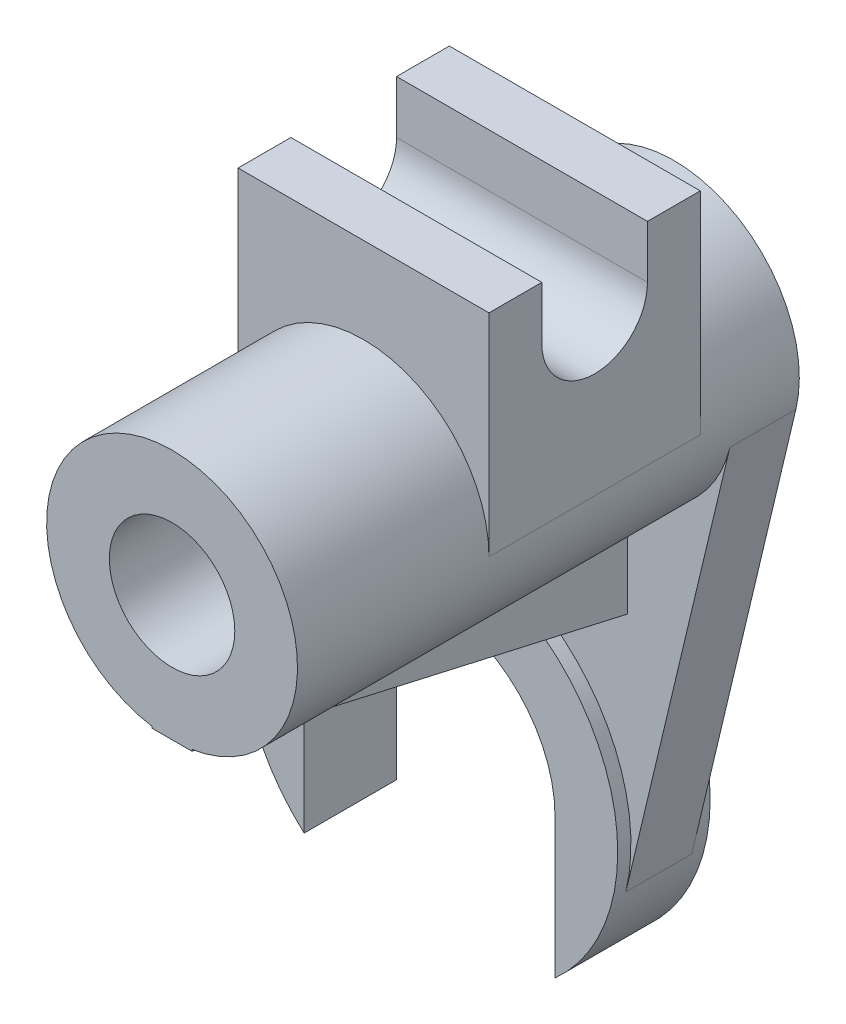
ISO-10303-21;
HEADER;
FILE_DESCRIPTION(('STEP AP214'),'2;1');
FILE_NAME('part.step','',(''),(''),'','','');
FILE_SCHEMA(('AUTOMOTIVE_DESIGN { 1 0 10303 214 1 1 1 1 }'));
ENDSEC;
DATA;
#1=APPLICATION_CONTEXT('core data for automotive mechanical design processes');
#2=APPLICATION_PROTOCOL_DEFINITION('international standard','automotive_design',2000,#1);
#3=PRODUCT_CONTEXT('',#1,'mechanical');
#4=PRODUCT('Part','Part','',(#3));
#5=PRODUCT_RELATED_PRODUCT_CATEGORY('part','',(#4));
#6=PRODUCT_DEFINITION_FORMATION('','',#4);
#7=PRODUCT_DEFINITION_CONTEXT('part definition',#1,'design');
#8=PRODUCT_DEFINITION('design','',#6,#7);
#9=PRODUCT_DEFINITION_SHAPE('','',#8);
#10=(LENGTH_UNIT() NAMED_UNIT(*) SI_UNIT(.MILLI.,.METRE.));
#11=(NAMED_UNIT(*) PLANE_ANGLE_UNIT() SI_UNIT($,.RADIAN.));
#12=(NAMED_UNIT(*) SI_UNIT($,.STERADIAN.) SOLID_ANGLE_UNIT());
#13=UNCERTAINTY_MEASURE_WITH_UNIT(LENGTH_MEASURE(1.E-05),#10,'distance_accuracy_value','');
#14=(GEOMETRIC_REPRESENTATION_CONTEXT(3) GLOBAL_UNCERTAINTY_ASSIGNED_CONTEXT((#13)) GLOBAL_UNIT_ASSIGNED_CONTEXT((#10,
#11,#12)) REPRESENTATION_CONTEXT('',''));
#15=CARTESIAN_POINT('',(0.,0.,0.));
#16=DIRECTION('',(0.,0.,1.));
#17=DIRECTION('',(1.,0.,0.));
#18=AXIS2_PLACEMENT_3D('',#15,#16,#17);
#19=CARTESIAN_POINT('',(0.,0.,38.));
#20=DIRECTION('',(0.,0.,-1.));
#21=DIRECTION('',(-1.,0.,0.));
#22=AXIS2_PLACEMENT_3D('',#19,#20,#21);
#23=CYLINDRICAL_SURFACE('',#22,19.);
#24=DIRECTION('',(0.,0.,-1.));
#25=VECTOR('',#24,1.);
#26=CARTESIAN_POINT('',(19.,0.,9.));
#27=LINE('',#26,#25);
#28=CARTESIAN_POINT('',(19.,0.,9.));
#29=VERTEX_POINT('',#28);
#30=CARTESIAN_POINT('',(19.,0.,-23.));
#31=VERTEX_POINT('',#30);
#32=EDGE_CURVE('E224',#29,#31,#27,.T.);
#33=ORIENTED_EDGE('',*,*,#32,.F.);
#34=CARTESIAN_POINT('',(0.,0.,9.));
#35=DIRECTION('',(0.,0.,-1.));
#36=DIRECTION('',(-1.,0.,0.));
#37=AXIS2_PLACEMENT_3D('',#34,#35,#36);
#38=CIRCLE('',#37,19.);
#39=CARTESIAN_POINT('',(-19.,0.,9.));
#40=VERTEX_POINT('',#39);
#41=EDGE_CURVE('E389',#40,#29,#38,.T.);
#42=ORIENTED_EDGE('',*,*,#41,.F.);
#43=DIRECTION('',(0.,0.,-1.));
#44=VECTOR('',#43,1.);
#45=CARTESIAN_POINT('',(-19.,0.,9.));
#46=LINE('',#45,#44);
#47=CARTESIAN_POINT('',(-19.,0.,-23.));
#48=VERTEX_POINT('',#47);
#49=EDGE_CURVE('E252',#40,#48,#46,.T.);
#50=ORIENTED_EDGE('',*,*,#49,.T.);
#51=CARTESIAN_POINT('',(0.,0.,-23.));
#52=DIRECTION('',(0.,0.,1.));
#53=DIRECTION('',(1.,0.,0.));
#54=AXIS2_PLACEMENT_3D('',#51,#52,#53);
#55=CIRCLE('',#54,19.);
#56=EDGE_CURVE('E394',#31,#48,#55,.T.);
#57=ORIENTED_EDGE('',*,*,#56,.F.);
#58=EDGE_LOOP('',(#33,#42,#50,#57));
#59=FACE_BOUND('',#58,.T.);
#60=DIRECTION('',(0.,0.,-1.));
#61=VECTOR('',#60,1.);
#62=CARTESIAN_POINT('',(3.,-18.7616630392937,38.));
#63=LINE('',#62,#61);
#64=CARTESIAN_POINT('',(3.,-18.7616630392937,-28.));
#65=VERTEX_POINT('',#64);
#66=CARTESIAN_POINT('',(3.,-18.7616630392937,38.));
#67=VERTEX_POINT('',#66);
#68=EDGE_CURVE('E187',#65,#67,#63,.F.);
#69=ORIENTED_EDGE('',*,*,#68,.F.);
#70=CARTESIAN_POINT('',(0.,0.,-28.));
#71=DIRECTION('',(0.,0.,1.));
#72=DIRECTION('',(-1.,0.,0.));
#73=AXIS2_PLACEMENT_3D('',#70,#71,#72);
#74=CIRCLE('',#73,19.);
#75=CARTESIAN_POINT('',(18.4835481744986,-4.39982350566352,-28.));
#76=VERTEX_POINT('',#75);
#77=EDGE_CURVE('E348',#65,#76,#74,.T.);
#78=ORIENTED_EDGE('',*,*,#77,.T.);
#79=DIRECTION('',(0.,0.,-1.));
#80=VECTOR('',#79,1.);
#81=CARTESIAN_POINT('',(18.4835481744986,-4.39982350566352,-28.));
#82=LINE('',#81,#80);
#83=CARTESIAN_POINT('',(18.4835481744986,-4.39982350566352,-38.));
#84=VERTEX_POINT('',#83);
#85=EDGE_CURVE('E360',#76,#84,#82,.T.);
#86=ORIENTED_EDGE('',*,*,#85,.T.);
#87=CARTESIAN_POINT('',(0.,0.,-38.));
#88=DIRECTION('',(0.,0.,1.));
#89=DIRECTION('',(1.,0.,0.));
#90=AXIS2_PLACEMENT_3D('',#87,#88,#89);
#91=CIRCLE('',#90,19.);
#92=CARTESIAN_POINT('',(-16.5718769184088,9.29370192125344,-38.));
#93=VERTEX_POINT('',#92);
#94=EDGE_CURVE('E375',#84,#93,#91,.T.);
#95=ORIENTED_EDGE('',*,*,#94,.T.);
#96=DIRECTION('',(0.,0.,-1.));
#97=VECTOR('',#96,1.);
#98=CARTESIAN_POINT('',(-16.5718769184088,9.29370192125344,-28.));
#99=LINE('',#98,#97);
#100=CARTESIAN_POINT('',(-16.5718769184088,9.29370192125344,-28.));
#101=VERTEX_POINT('',#100);
#102=EDGE_CURVE('E371',#101,#93,#99,.T.);
#103=ORIENTED_EDGE('',*,*,#102,.F.);
#104=CARTESIAN_POINT('',(-3.,-18.7616630392937,-28.));
#105=VERTEX_POINT('',#104);
#106=EDGE_CURVE('E343',#101,#105,#74,.T.);
#107=ORIENTED_EDGE('',*,*,#106,.T.);
#108=DIRECTION('',(0.,0.,-1.));
#109=VECTOR('',#108,1.);
#110=CARTESIAN_POINT('',(-3.,-18.7616630392937,38.));
#111=LINE('',#110,#109);
#112=CARTESIAN_POINT('',(-3.,-18.7616630392937,38.));
#113=VERTEX_POINT('',#112);
#114=EDGE_CURVE('E60',#105,#113,#111,.F.);
#115=ORIENTED_EDGE('',*,*,#114,.T.);
#116=CARTESIAN_POINT('',(0.,0.,38.));
#117=DIRECTION('',(0.,0.,1.));
#118=DIRECTION('',(1.,0.,0.));
#119=AXIS2_PLACEMENT_3D('',#116,#117,#118);
#120=CIRCLE('',#119,19.);
#121=EDGE_CURVE('E386',#67,#113,#120,.T.);
#122=ORIENTED_EDGE('',*,*,#121,.F.);
#123=EDGE_LOOP('',(#69,#78,#86,#95,#103,#107,#115,#122));
#124=FACE_BOUND('',#123,.T.);
#125=ADVANCED_FACE('F45',(#59,#124),#23,.T.);
#126=CARTESIAN_POINT('',(0.,0.,-28.));
#127=DIRECTION('',(0.,0.,-1.));
#128=DIRECTION('',(-1.,0.,0.));
#129=AXIS2_PLACEMENT_3D('',#126,#127,#128);
#130=PLANE('',#129);
#131=DIRECTION('',(0.,1.,0.));
#132=VECTOR('',#131,1.);
#133=CARTESIAN_POINT('',(3.,0.,-28.));
#134=LINE('',#133,#132);
#135=CARTESIAN_POINT('',(3.,-34.,-28.));
#136=VERTEX_POINT('',#135);
#137=EDGE_CURVE('E11',#136,#65,#134,.T.);
#138=ORIENTED_EDGE('',*,*,#137,.F.);
#139=DIRECTION('',(-1.,0.,0.));
#140=VECTOR('',#139,1.);
#141=CARTESIAN_POINT('',(3.,-34.,-28.));
#142=LINE('',#141,#140);
#143=CARTESIAN_POINT('',(-3.,-34.,-28.));
#144=VERTEX_POINT('',#143);
#145=EDGE_CURVE('E201',#136,#144,#142,.T.);
#146=ORIENTED_EDGE('',*,*,#145,.T.);
#147=DIRECTION('',(0.,1.,0.));
#148=VECTOR('',#147,1.);
#149=CARTESIAN_POINT('',(-3.,0.,-28.));
#150=LINE('',#149,#148);
#151=EDGE_CURVE('E53',#144,#105,#150,.T.);
#152=ORIENTED_EDGE('',*,*,#151,.T.);
#153=ORIENTED_EDGE('',*,*,#106,.F.);
#154=DIRECTION('',(0.48914220638176,0.872204048337305,0.));
#155=VECTOR('',#154,1.);
#156=CARTESIAN_POINT('',(-16.5718769184088,9.29370192125344,-28.));
#157=LINE('',#156,#155);
#158=CARTESIAN_POINT('',(-49.8578153776132,-50.0594471181198,-28.));
#159=VERTEX_POINT('',#158);
#160=EDGE_CURVE('E356',#159,#101,#157,.T.);
#161=ORIENTED_EDGE('',*,*,#160,.F.);
#162=CARTESIAN_POINT('',(-25.,-64.,-28.));
#163=DIRECTION('',(0.,0.,1.));
#164=DIRECTION('',(-1.,0.,0.));
#165=AXIS2_PLACEMENT_3D('',#162,#163,#164);
#166=CIRCLE('',#165,28.5);
#167=CARTESIAN_POINT('',(2.72532226174791,-70.5997352584953,-28.));
#168=VERTEX_POINT('',#167);
#169=EDGE_CURVE('E352',#168,#159,#166,.T.);
#170=ORIENTED_EDGE('',*,*,#169,.F.);
#171=DIRECTION('',(-0.231569658192817,-0.972818324973611,0.));
#172=VECTOR('',#171,1.);
#173=CARTESIAN_POINT('',(18.4835481744986,-4.39982350566352,-28.));
#174=LINE('',#173,#172);
#175=EDGE_CURVE('E347',#76,#168,#174,.T.);
#176=ORIENTED_EDGE('',*,*,#175,.F.);
#177=ORIENTED_EDGE('',*,*,#77,.F.);
#178=EDGE_LOOP('',(#138,#146,#152,#153,#161,#170,#176,#177));
#179=FACE_BOUND('',#178,.T.);
#180=ADVANCED_FACE('F402',(#179),#130,.F.);
#181=CARTESIAN_POINT('',(0.,0.,38.));
#182=DIRECTION('',(0.,0.,1.));
#183=DIRECTION('',(1.,0.,0.));
#184=AXIS2_PLACEMENT_3D('',#181,#182,#183);
#185=PLANE('',#184);
#186=DIRECTION('',(0.,-1.,0.));
#187=VECTOR('',#186,1.);
#188=CARTESIAN_POINT('',(-3.,-19.,38.));
#189=LINE('',#188,#187);
#190=CARTESIAN_POINT('',(-3.,-19.,38.));
#191=VERTEX_POINT('',#190);
#192=EDGE_CURVE('E207',#113,#191,#189,.T.);
#193=ORIENTED_EDGE('',*,*,#192,.T.);
#194=DIRECTION('',(-1.,0.,0.));
#195=VECTOR('',#194,1.);
#196=CARTESIAN_POINT('',(3.,-19.,38.));
#197=LINE('',#196,#195);
#198=CARTESIAN_POINT('',(3.,-19.,38.));
#199=VERTEX_POINT('',#198);
#200=EDGE_CURVE('E198',#199,#191,#197,.T.);
#201=ORIENTED_EDGE('',*,*,#200,.F.);
#202=DIRECTION('',(0.,-1.,0.));
#203=VECTOR('',#202,1.);
#204=CARTESIAN_POINT('',(3.,-19.,38.));
#205=LINE('',#204,#203);
#206=EDGE_CURVE('E181',#67,#199,#205,.T.);
#207=ORIENTED_EDGE('',*,*,#206,.F.);
#208=ORIENTED_EDGE('',*,*,#121,.T.);
#209=EDGE_LOOP('',(#193,#201,#207,#208));
#210=FACE_BOUND('',#209,.T.);
#211=CARTESIAN_POINT('',(0.,0.,38.));
#212=DIRECTION('',(0.,0.,1.));
#213=DIRECTION('',(1.,0.,0.));
#214=AXIS2_PLACEMENT_3D('',#211,#212,#213);
#215=CIRCLE('',#214,9.50000000000001);
#216=CARTESIAN_POINT('',(9.50000000000001,0.,38.));
#217=VERTEX_POINT('',#216);
#218=EDGE_CURVE('E219',#217,#217,#215,.T.);
#219=ORIENTED_EDGE('',*,*,#218,.F.);
#220=EDGE_LOOP('',(#219));
#221=FACE_BOUND('',#220,.T.);
#222=ADVANCED_FACE('F205',(#210,#221),#185,.T.);
#223=CARTESIAN_POINT('',(0.,0.,-38.));
#224=DIRECTION('',(0.,0.,1.));
#225=DIRECTION('',(1.,0.,0.));
#226=AXIS2_PLACEMENT_3D('',#223,#224,#225);
#227=PLANE('',#226);
#228=CARTESIAN_POINT('',(0.,0.,-38.));
#229=DIRECTION('',(0.,0.,1.));
#230=DIRECTION('',(1.,0.,0.));
#231=AXIS2_PLACEMENT_3D('',#228,#229,#230);
#232=CIRCLE('',#231,9.50000000000001);
#233=CARTESIAN_POINT('',(9.50000000000001,0.,-38.));
#234=VERTEX_POINT('',#233);
#235=EDGE_CURVE('E223',#234,#234,#232,.T.);
#236=ORIENTED_EDGE('',*,*,#235,.T.);
#237=EDGE_LOOP('',(#236));
#238=FACE_BOUND('',#237,.T.);
#239=ORIENTED_EDGE('',*,*,#94,.F.);
#240=DIRECTION('',(-0.231569658192817,-0.972818324973611,0.));
#241=VECTOR('',#240,1.);
#242=CARTESIAN_POINT('',(18.4835481744986,-4.39982350566352,-38.));
#243=LINE('',#242,#241);
#244=CARTESIAN_POINT('',(2.72532226174791,-70.5997352584953,-38.));
#245=VERTEX_POINT('',#244);
#246=EDGE_CURVE('E334',#84,#245,#243,.T.);
#247=ORIENTED_EDGE('',*,*,#246,.T.);
#248=CARTESIAN_POINT('',(-25.,-64.,-38.));
#249=DIRECTION('',(0.,0.,1.));
#250=DIRECTION('',(-1.,0.,0.));
#251=AXIS2_PLACEMENT_3D('',#248,#249,#250);
#252=CIRCLE('',#251,28.5);
#253=CARTESIAN_POINT('',(-49.8578153776132,-50.0594471181198,-38.));
#254=VERTEX_POINT('',#253);
#255=EDGE_CURVE('E364',#245,#254,#252,.T.);
#256=ORIENTED_EDGE('',*,*,#255,.T.);
#257=DIRECTION('',(0.48914220638176,0.872204048337305,0.));
#258=VECTOR('',#257,1.);
#259=CARTESIAN_POINT('',(-16.5718769184088,9.29370192125344,-38.));
#260=LINE('',#259,#258);
#261=EDGE_CURVE('E367',#254,#93,#260,.T.);
#262=ORIENTED_EDGE('',*,*,#261,.T.);
#263=EDGE_LOOP('',(#239,#247,#256,#262));
#264=FACE_BOUND('',#263,.T.);
#265=ADVANCED_FACE('F409',(#238,#264),#227,.F.);
#266=CARTESIAN_POINT('',(-16.5718769184088,9.29370192125344,-28.));
#267=DIRECTION('',(-0.872204048337305,0.48914220638176,0.));
#268=DIRECTION('',(-0.48914220638176,-0.872204048337305,0.));
#269=AXIS2_PLACEMENT_3D('',#266,#267,#268);
#270=PLANE('',#269);
#271=ORIENTED_EDGE('',*,*,#261,.F.);
#272=DIRECTION('',(0.,0.,-1.));
#273=VECTOR('',#272,1.);
#274=CARTESIAN_POINT('',(-49.8578153776132,-50.0594471181198,-28.));
#275=LINE('',#274,#273);
#276=EDGE_CURVE('E376',#159,#254,#275,.T.);
#277=ORIENTED_EDGE('',*,*,#276,.F.);
#278=ORIENTED_EDGE('',*,*,#160,.T.);
#279=ORIENTED_EDGE('',*,*,#102,.T.);
#280=EDGE_LOOP('',(#271,#277,#278,#279));
#281=FACE_BOUND('',#280,.T.);
#282=ADVANCED_FACE('F406',(#281),#270,.T.);
#283=CARTESIAN_POINT('',(18.4835481744986,-4.39982350566352,-28.));
#284=DIRECTION('',(0.972818324973611,-0.231569658192817,0.));
#285=DIRECTION('',(0.231569658192817,0.972818324973611,0.));
#286=AXIS2_PLACEMENT_3D('',#283,#284,#285);
#287=PLANE('',#286);
#288=ORIENTED_EDGE('',*,*,#246,.F.);
#289=ORIENTED_EDGE('',*,*,#85,.F.);
#290=ORIENTED_EDGE('',*,*,#175,.T.);
#291=DIRECTION('',(0.,0.,-1.));
#292=VECTOR('',#291,1.);
#293=CARTESIAN_POINT('',(2.72532226174791,-70.5997352584953,-28.));
#294=LINE('',#293,#292);
#295=EDGE_CURVE('E380',#168,#245,#294,.T.);
#296=ORIENTED_EDGE('',*,*,#295,.T.);
#297=EDGE_LOOP('',(#288,#289,#290,#296));
#298=FACE_BOUND('',#297,.T.);
#299=ADVANCED_FACE('F419',(#298),#287,.T.);
#300=CARTESIAN_POINT('',(-25.,-64.,-26.));
#301=DIRECTION('',(0.,0.,-1.));
#302=DIRECTION('',(-1.,0.,0.));
#303=AXIS2_PLACEMENT_3D('',#300,#301,#302);
#304=CYLINDRICAL_SURFACE('',#303,28.5);
#305=DIRECTION('',(0.,0.,-1.));
#306=VECTOR('',#305,1.);
#307=CARTESIAN_POINT('',(-5.99999999999999,-85.242645786248,-26.));
#308=LINE('',#307,#306);
#309=CARTESIAN_POINT('',(-5.99999999999999,-85.242645786248,-26.));
#310=VERTEX_POINT('',#309);
#311=CARTESIAN_POINT('',(-5.99999999999999,-85.242645786248,-40.));
#312=VERTEX_POINT('',#311);
#313=EDGE_CURVE('E335',#310,#312,#308,.T.);
#314=ORIENTED_EDGE('',*,*,#313,.T.);
#315=CARTESIAN_POINT('',(-25.,-64.,-40.));
#316=DIRECTION('',(0.,0.,-1.));
#317=DIRECTION('',(-1.,0.,0.));
#318=AXIS2_PLACEMENT_3D('',#315,#316,#317);
#319=CIRCLE('',#318,28.5);
#320=CARTESIAN_POINT('',(-44.,-85.242645786248,-40.));
#321=VERTEX_POINT('',#320);
#322=EDGE_CURVE('E306',#321,#312,#319,.T.);
#323=ORIENTED_EDGE('',*,*,#322,.F.);
#324=DIRECTION('',(0.,0.,-1.));
#325=VECTOR('',#324,1.);
#326=CARTESIAN_POINT('',(-44.,-85.242645786248,-26.));
#327=LINE('',#326,#325);
#328=CARTESIAN_POINT('',(-44.,-85.242645786248,-26.));
#329=VERTEX_POINT('',#328);
#330=EDGE_CURVE('E338',#329,#321,#327,.T.);
#331=ORIENTED_EDGE('',*,*,#330,.F.);
#332=CARTESIAN_POINT('',(-25.,-64.,-26.));
#333=DIRECTION('',(0.,0.,-1.));
#334=DIRECTION('',(-1.,0.,0.));
#335=AXIS2_PLACEMENT_3D('',#332,#333,#334);
#336=CIRCLE('',#335,28.5);
#337=EDGE_CURVE('E322',#329,#310,#336,.T.);
#338=ORIENTED_EDGE('',*,*,#337,.T.);
#339=EDGE_LOOP('',(#314,#323,#331,#338));
#340=FACE_BOUND('',#339,.T.);
#341=ORIENTED_EDGE('',*,*,#255,.F.);
#342=ORIENTED_EDGE('',*,*,#295,.F.);
#343=ORIENTED_EDGE('',*,*,#169,.T.);
#344=ORIENTED_EDGE('',*,*,#276,.T.);
#345=EDGE_LOOP('',(#341,#342,#343,#344));
#346=FACE_BOUND('',#345,.T.);
#347=ADVANCED_FACE('F414',(#340,#346),#304,.T.);
#348=CARTESIAN_POINT('',(-25.,-64.,-26.));
#349=DIRECTION('',(0.,0.,-1.));
#350=DIRECTION('',(-1.,0.,0.));
#351=AXIS2_PLACEMENT_3D('',#348,#349,#350);
#352=CYLINDRICAL_SURFACE('',#351,19.);
#353=DIRECTION('',(0.,0.,-1.));
#354=VECTOR('',#353,1.);
#355=CARTESIAN_POINT('',(-44.,-64.,-26.));
#356=LINE('',#355,#354);
#357=CARTESIAN_POINT('',(-44.,-64.,-26.));
#358=VERTEX_POINT('',#357);
#359=CARTESIAN_POINT('',(-44.,-64.,-40.));
#360=VERTEX_POINT('',#359);
#361=EDGE_CURVE('E330',#358,#360,#356,.T.);
#362=ORIENTED_EDGE('',*,*,#361,.T.);
#363=CARTESIAN_POINT('',(-25.,-64.,-40.));
#364=DIRECTION('',(0.,0.,1.));
#365=DIRECTION('',(-1.,0.,0.));
#366=AXIS2_PLACEMENT_3D('',#363,#364,#365);
#367=CIRCLE('',#366,19.);
#368=CARTESIAN_POINT('',(-6.,-64.,-40.));
#369=VERTEX_POINT('',#368);
#370=EDGE_CURVE('E298',#369,#360,#367,.T.);
#371=ORIENTED_EDGE('',*,*,#370,.F.);
#372=DIRECTION('',(0.,0.,-1.));
#373=VECTOR('',#372,1.);
#374=CARTESIAN_POINT('',(-6.,-64.,-26.));
#375=LINE('',#374,#373);
#376=CARTESIAN_POINT('',(-6.,-64.,-26.));
#377=VERTEX_POINT('',#376);
#378=EDGE_CURVE('E331',#377,#369,#375,.T.);
#379=ORIENTED_EDGE('',*,*,#378,.F.);
#380=CARTESIAN_POINT('',(-25.,-64.,-26.));
#381=DIRECTION('',(0.,0.,1.));
#382=DIRECTION('',(-1.,0.,0.));
#383=AXIS2_PLACEMENT_3D('',#380,#381,#382);
#384=CIRCLE('',#383,19.);
#385=EDGE_CURVE('E314',#377,#358,#384,.T.);
#386=ORIENTED_EDGE('',*,*,#385,.T.);
#387=EDGE_LOOP('',(#362,#371,#379,#386));
#388=FACE_BOUND('',#387,.T.);
#389=ADVANCED_FACE('F427',(#388),#352,.F.);
#390=CARTESIAN_POINT('',(-6.,-64.,-26.));
#391=DIRECTION('',(-1.,0.,0.));
#392=DIRECTION('',(0.,-1.,0.));
#393=AXIS2_PLACEMENT_3D('',#390,#391,#392);
#394=PLANE('',#393);
#395=ORIENTED_EDGE('',*,*,#378,.T.);
#396=DIRECTION('',(0.,1.,0.));
#397=VECTOR('',#396,1.);
#398=CARTESIAN_POINT('',(-6.,-64.,-40.));
#399=LINE('',#398,#397);
#400=EDGE_CURVE('E310',#312,#369,#399,.T.);
#401=ORIENTED_EDGE('',*,*,#400,.F.);
#402=ORIENTED_EDGE('',*,*,#313,.F.);
#403=DIRECTION('',(0.,1.,0.));
#404=VECTOR('',#403,1.);
#405=CARTESIAN_POINT('',(-6.,-64.,-26.));
#406=LINE('',#405,#404);
#407=EDGE_CURVE('E326',#310,#377,#406,.T.);
#408=ORIENTED_EDGE('',*,*,#407,.T.);
#409=EDGE_LOOP('',(#395,#401,#402,#408));
#410=FACE_BOUND('',#409,.T.);
#411=ADVANCED_FACE('F498',(#410),#394,.T.);
#412=CARTESIAN_POINT('',(-44.,-64.,-26.));
#413=DIRECTION('',(1.,0.,0.));
#414=DIRECTION('',(0.,1.,0.));
#415=AXIS2_PLACEMENT_3D('',#412,#413,#414);
#416=PLANE('',#415);
#417=ORIENTED_EDGE('',*,*,#330,.T.);
#418=DIRECTION('',(0.,-1.,0.));
#419=VECTOR('',#418,1.);
#420=CARTESIAN_POINT('',(-44.,-64.,-40.));
#421=LINE('',#420,#419);
#422=EDGE_CURVE('E302',#360,#321,#421,.T.);
#423=ORIENTED_EDGE('',*,*,#422,.F.);
#424=ORIENTED_EDGE('',*,*,#361,.F.);
#425=DIRECTION('',(0.,-1.,0.));
#426=VECTOR('',#425,1.);
#427=CARTESIAN_POINT('',(-44.,-64.,-26.));
#428=LINE('',#427,#426);
#429=EDGE_CURVE('E318',#358,#329,#428,.T.);
#430=ORIENTED_EDGE('',*,*,#429,.T.);
#431=EDGE_LOOP('',(#417,#423,#424,#430));
#432=FACE_BOUND('',#431,.T.);
#433=ADVANCED_FACE('F496',(#432),#416,.T.);
#434=CARTESIAN_POINT('',(-25.,-64.,-26.));
#435=DIRECTION('',(0.,0.,-1.));
#436=DIRECTION('',(-1.,0.,0.));
#437=AXIS2_PLACEMENT_3D('',#434,#435,#436);
#438=PLANE('',#437);
#439=ORIENTED_EDGE('',*,*,#385,.F.);
#440=ORIENTED_EDGE('',*,*,#407,.F.);
#441=ORIENTED_EDGE('',*,*,#337,.F.);
#442=ORIENTED_EDGE('',*,*,#429,.F.);
#443=EDGE_LOOP('',(#439,#440,#441,#442));
#444=FACE_BOUND('',#443,.T.);
#445=ADVANCED_FACE('F492',(#444),#438,.F.);
#446=CARTESIAN_POINT('',(-25.,-64.,-40.));
#447=DIRECTION('',(0.,0.,-1.));
#448=DIRECTION('',(-1.,0.,0.));
#449=AXIS2_PLACEMENT_3D('',#446,#447,#448);
#450=PLANE('',#449);
#451=ORIENTED_EDGE('',*,*,#370,.T.);
#452=ORIENTED_EDGE('',*,*,#422,.T.);
#453=ORIENTED_EDGE('',*,*,#322,.T.);
#454=ORIENTED_EDGE('',*,*,#400,.T.);
#455=EDGE_LOOP('',(#451,#452,#453,#454));
#456=FACE_BOUND('',#455,.T.);
#457=ADVANCED_FACE('F478',(#456),#450,.T.);
#458=CARTESIAN_POINT('',(19.,24.,-7.));
#459=DIRECTION('',(-1.,0.,0.));
#460=DIRECTION('',(0.,0.,1.));
#461=AXIS2_PLACEMENT_3D('',#458,#459,#460);
#462=CYLINDRICAL_SURFACE('',#461,8.);
#463=CARTESIAN_POINT('',(-19.,24.,-7.));
#464=DIRECTION('',(-1.,0.,0.));
#465=DIRECTION('',(0.,0.,-1.));
#466=AXIS2_PLACEMENT_3D('',#463,#464,#465);
#467=CIRCLE('',#466,8.);
#468=CARTESIAN_POINT('',(-19.,24.,-15.));
#469=VERTEX_POINT('',#468);
#470=CARTESIAN_POINT('',(-19.,24.,0.999999999999999));
#471=VERTEX_POINT('',#470);
#472=EDGE_CURVE('E264',#469,#471,#467,.T.);
#473=ORIENTED_EDGE('',*,*,#472,.T.);
#474=DIRECTION('',(-1.,0.,0.));
#475=VECTOR('',#474,1.);
#476=CARTESIAN_POINT('',(19.,24.,0.999999999999999));
#477=LINE('',#476,#475);
#478=CARTESIAN_POINT('',(19.,24.,0.999999999999999));
#479=VERTEX_POINT('',#478);
#480=EDGE_CURVE('E282',#479,#471,#477,.T.);
#481=ORIENTED_EDGE('',*,*,#480,.F.);
#482=CARTESIAN_POINT('',(19.,24.,-7.));
#483=DIRECTION('',(-1.,0.,0.));
#484=DIRECTION('',(0.,0.,-1.));
#485=AXIS2_PLACEMENT_3D('',#482,#483,#484);
#486=CIRCLE('',#485,8.);
#487=CARTESIAN_POINT('',(19.,24.,-15.));
#488=VERTEX_POINT('',#487);
#489=EDGE_CURVE('E238',#488,#479,#486,.T.);
#490=ORIENTED_EDGE('',*,*,#489,.F.);
#491=DIRECTION('',(-1.,0.,0.));
#492=VECTOR('',#491,1.);
#493=CARTESIAN_POINT('',(19.,24.,-15.));
#494=LINE('',#493,#492);
#495=EDGE_CURVE('E286',#488,#469,#494,.T.);
#496=ORIENTED_EDGE('',*,*,#495,.T.);
#497=EDGE_LOOP('',(#473,#481,#490,#496));
#498=FACE_BOUND('',#497,.T.);
#499=ADVANCED_FACE('F475',(#498),#462,.F.);
#500=CARTESIAN_POINT('',(19.,0.,-23.));
#501=DIRECTION('',(0.,0.,1.));
#502=DIRECTION('',(1.,0.,0.));
#503=AXIS2_PLACEMENT_3D('',#500,#501,#502);
#504=PLANE('',#503);
#505=DIRECTION('',(0.,1.,0.));
#506=VECTOR('',#505,1.);
#507=CARTESIAN_POINT('',(19.,0.,-23.));
#508=LINE('',#507,#506);
#509=CARTESIAN_POINT('',(19.,32.,-23.));
#510=VERTEX_POINT('',#509);
#511=EDGE_CURVE('E228',#31,#510,#508,.T.);
#512=ORIENTED_EDGE('',*,*,#511,.F.);
#513=ORIENTED_EDGE('',*,*,#56,.T.);
#514=DIRECTION('',(0.,1.,0.));
#515=VECTOR('',#514,1.);
#516=CARTESIAN_POINT('',(-19.,0.,-23.));
#517=LINE('',#516,#515);
#518=CARTESIAN_POINT('',(-19.,32.,-23.));
#519=VERTEX_POINT('',#518);
#520=EDGE_CURVE('E68',#48,#519,#517,.T.);
#521=ORIENTED_EDGE('',*,*,#520,.T.);
#522=DIRECTION('',(-1.,0.,0.));
#523=VECTOR('',#522,1.);
#524=CARTESIAN_POINT('',(19.,32.,-23.));
#525=LINE('',#524,#523);
#526=EDGE_CURVE('E294',#510,#519,#525,.T.);
#527=ORIENTED_EDGE('',*,*,#526,.F.);
#528=EDGE_LOOP('',(#512,#513,#521,#527));
#529=FACE_BOUND('',#528,.T.);
#530=ADVANCED_FACE('F477',(#529),#504,.F.);
#531=CARTESIAN_POINT('',(19.,32.,-23.));
#532=DIRECTION('',(0.,-1.,0.));
#533=DIRECTION('',(0.,0.,-1.));
#534=AXIS2_PLACEMENT_3D('',#531,#532,#533);
#535=PLANE('',#534);
#536=DIRECTION('',(0.,0.,1.));
#537=VECTOR('',#536,1.);
#538=CARTESIAN_POINT('',(-19.,32.,-23.));
#539=LINE('',#538,#537);
#540=CARTESIAN_POINT('',(-19.,32.,-15.));
#541=VERTEX_POINT('',#540);
#542=EDGE_CURVE('E258',#519,#541,#539,.T.);
#543=ORIENTED_EDGE('',*,*,#542,.T.);
#544=DIRECTION('',(-1.,0.,0.));
#545=VECTOR('',#544,1.);
#546=CARTESIAN_POINT('',(19.,32.,-15.));
#547=LINE('',#546,#545);
#548=CARTESIAN_POINT('',(19.,32.,-15.));
#549=VERTEX_POINT('',#548);
#550=EDGE_CURVE('E290',#549,#541,#547,.T.);
#551=ORIENTED_EDGE('',*,*,#550,.F.);
#552=DIRECTION('',(0.,0.,1.));
#553=VECTOR('',#552,1.);
#554=CARTESIAN_POINT('',(19.,32.,-23.));
#555=LINE('',#554,#553);
#556=EDGE_CURVE('E232',#510,#549,#555,.T.);
#557=ORIENTED_EDGE('',*,*,#556,.F.);
#558=ORIENTED_EDGE('',*,*,#526,.T.);
#559=EDGE_LOOP('',(#543,#551,#557,#558));
#560=FACE_BOUND('',#559,.T.);
#561=ADVANCED_FACE('F482',(#560),#535,.F.);
#562=CARTESIAN_POINT('',(19.,32.,-15.));
#563=DIRECTION('',(0.,0.,-1.));
#564=DIRECTION('',(-1.,0.,0.));
#565=AXIS2_PLACEMENT_3D('',#562,#563,#564);
#566=PLANE('',#565);
#567=DIRECTION('',(0.,-1.,0.));
#568=VECTOR('',#567,1.);
#569=CARTESIAN_POINT('',(-19.,32.,-15.));
#570=LINE('',#569,#568);
#571=EDGE_CURVE('E261',#541,#469,#570,.T.);
#572=ORIENTED_EDGE('',*,*,#571,.T.);
#573=ORIENTED_EDGE('',*,*,#495,.F.);
#574=DIRECTION('',(0.,-1.,0.));
#575=VECTOR('',#574,1.);
#576=CARTESIAN_POINT('',(19.,32.,-15.));
#577=LINE('',#576,#575);
#578=EDGE_CURVE('E235',#549,#488,#577,.T.);
#579=ORIENTED_EDGE('',*,*,#578,.F.);
#580=ORIENTED_EDGE('',*,*,#550,.T.);
#581=EDGE_LOOP('',(#572,#573,#579,#580));
#582=FACE_BOUND('',#581,.T.);
#583=ADVANCED_FACE('F473',(#582),#566,.F.);
#584=CARTESIAN_POINT('',(19.,32.,1.));
#585=DIRECTION('',(0.,0.,1.));
#586=DIRECTION('',(0.,-1.,0.));
#587=AXIS2_PLACEMENT_3D('',#584,#585,#586);
#588=PLANE('',#587);
#589=DIRECTION('',(0.,1.,0.));
#590=VECTOR('',#589,1.);
#591=CARTESIAN_POINT('',(-19.,32.,1.));
#592=LINE('',#591,#590);
#593=CARTESIAN_POINT('',(-19.,32.,1.));
#594=VERTEX_POINT('',#593);
#595=EDGE_CURVE('E267',#471,#594,#592,.T.);
#596=ORIENTED_EDGE('',*,*,#595,.T.);
#597=DIRECTION('',(-1.,0.,0.));
#598=VECTOR('',#597,1.);
#599=CARTESIAN_POINT('',(19.,32.,1.));
#600=LINE('',#599,#598);
#601=CARTESIAN_POINT('',(19.,32.,1.));
#602=VERTEX_POINT('',#601);
#603=EDGE_CURVE('E278',#602,#594,#600,.T.);
#604=ORIENTED_EDGE('',*,*,#603,.F.);
#605=DIRECTION('',(0.,1.,0.));
#606=VECTOR('',#605,1.);
#607=CARTESIAN_POINT('',(19.,32.,1.));
#608=LINE('',#607,#606);
#609=EDGE_CURVE('E241',#479,#602,#608,.T.);
#610=ORIENTED_EDGE('',*,*,#609,.F.);
#611=ORIENTED_EDGE('',*,*,#480,.T.);
#612=EDGE_LOOP('',(#596,#604,#610,#611));
#613=FACE_BOUND('',#612,.T.);
#614=ADVANCED_FACE('F469',(#613),#588,.F.);
#615=CARTESIAN_POINT('',(19.,32.,9.));
#616=DIRECTION('',(0.,-1.,0.));
#617=DIRECTION('',(0.,0.,-1.));
#618=AXIS2_PLACEMENT_3D('',#615,#616,#617);
#619=PLANE('',#618);
#620=DIRECTION('',(0.,0.,1.));
#621=VECTOR('',#620,1.);
#622=CARTESIAN_POINT('',(-19.,32.,9.));
#623=LINE('',#622,#621);
#624=CARTESIAN_POINT('',(-19.,32.,9.));
#625=VERTEX_POINT('',#624);
#626=EDGE_CURVE('E270',#594,#625,#623,.T.);
#627=ORIENTED_EDGE('',*,*,#626,.T.);
#628=DIRECTION('',(-1.,0.,0.));
#629=VECTOR('',#628,1.);
#630=CARTESIAN_POINT('',(19.,32.,9.));
#631=LINE('',#630,#629);
#632=CARTESIAN_POINT('',(19.,32.,9.));
#633=VERTEX_POINT('',#632);
#634=EDGE_CURVE('E251',#633,#625,#631,.T.);
#635=ORIENTED_EDGE('',*,*,#634,.F.);
#636=DIRECTION('',(0.,0.,1.));
#637=VECTOR('',#636,1.);
#638=CARTESIAN_POINT('',(19.,32.,9.));
#639=LINE('',#638,#637);
#640=EDGE_CURVE('E244',#602,#633,#639,.T.);
#641=ORIENTED_EDGE('',*,*,#640,.F.);
#642=ORIENTED_EDGE('',*,*,#603,.T.);
#643=EDGE_LOOP('',(#627,#635,#641,#642));
#644=FACE_BOUND('',#643,.T.);
#645=ADVANCED_FACE('F466',(#644),#619,.F.);
#646=CARTESIAN_POINT('',(19.,0.,9.));
#647=DIRECTION('',(0.,0.,-1.));
#648=DIRECTION('',(-1.,0.,0.));
#649=AXIS2_PLACEMENT_3D('',#646,#647,#648);
#650=PLANE('',#649);
#651=DIRECTION('',(0.,-1.,0.));
#652=VECTOR('',#651,1.);
#653=CARTESIAN_POINT('',(-19.,0.,9.));
#654=LINE('',#653,#652);
#655=EDGE_CURVE('E229',#625,#40,#654,.T.);
#656=ORIENTED_EDGE('',*,*,#655,.T.);
#657=ORIENTED_EDGE('',*,*,#41,.T.);
#658=DIRECTION('',(0.,-1.,0.));
#659=VECTOR('',#658,1.);
#660=CARTESIAN_POINT('',(19.,0.,9.));
#661=LINE('',#660,#659);
#662=EDGE_CURVE('E247',#633,#29,#661,.T.);
#663=ORIENTED_EDGE('',*,*,#662,.F.);
#664=ORIENTED_EDGE('',*,*,#634,.T.);
#665=EDGE_LOOP('',(#656,#657,#663,#664));
#666=FACE_BOUND('',#665,.T.);
#667=ADVANCED_FACE('F449',(#666),#650,.F.);
#668=CARTESIAN_POINT('',(19.,24.,-7.));
#669=DIRECTION('',(1.,0.,0.));
#670=DIRECTION('',(0.,0.,-1.));
#671=AXIS2_PLACEMENT_3D('',#668,#669,#670);
#672=PLANE('',#671);
#673=ORIENTED_EDGE('',*,*,#32,.T.);
#674=ORIENTED_EDGE('',*,*,#511,.T.);
#675=ORIENTED_EDGE('',*,*,#556,.T.);
#676=ORIENTED_EDGE('',*,*,#578,.T.);
#677=ORIENTED_EDGE('',*,*,#489,.T.);
#678=ORIENTED_EDGE('',*,*,#609,.T.);
#679=ORIENTED_EDGE('',*,*,#640,.T.);
#680=ORIENTED_EDGE('',*,*,#662,.T.);
#681=EDGE_LOOP('',(#673,#674,#675,#676,#677,#678,#679,#680));
#682=FACE_BOUND('',#681,.T.);
#683=ADVANCED_FACE('F443',(#682),#672,.T.);
#684=CARTESIAN_POINT('',(-19.,24.,-7.));
#685=DIRECTION('',(1.,0.,0.));
#686=DIRECTION('',(0.,0.,-1.));
#687=AXIS2_PLACEMENT_3D('',#684,#685,#686);
#688=PLANE('',#687);
#689=ORIENTED_EDGE('',*,*,#49,.F.);
#690=ORIENTED_EDGE('',*,*,#655,.F.);
#691=ORIENTED_EDGE('',*,*,#626,.F.);
#692=ORIENTED_EDGE('',*,*,#595,.F.);
#693=ORIENTED_EDGE('',*,*,#472,.F.);
#694=ORIENTED_EDGE('',*,*,#571,.F.);
#695=ORIENTED_EDGE('',*,*,#542,.F.);
#696=ORIENTED_EDGE('',*,*,#520,.F.);
#697=EDGE_LOOP('',(#689,#690,#691,#692,#693,#694,#695,#696));
#698=FACE_BOUND('',#697,.T.);
#699=ADVANCED_FACE('F452',(#698),#688,.F.);
#700=CARTESIAN_POINT('',(0.,0.,38.));
#701=DIRECTION('',(0.,0.,1.));
#702=DIRECTION('',(1.,0.,0.));
#703=AXIS2_PLACEMENT_3D('',#700,#701,#702);
#704=CYLINDRICAL_SURFACE('',#703,9.50000000000001);
#705=ORIENTED_EDGE('',*,*,#218,.T.);
#706=EDGE_LOOP('',(#705));
#707=FACE_BOUND('',#706,.T.);
#708=ORIENTED_EDGE('',*,*,#235,.F.);
#709=EDGE_LOOP('',(#708));
#710=FACE_BOUND('',#709,.T.);
#711=ADVANCED_FACE('F454',(#707,#710),#704,.F.);
#712=CARTESIAN_POINT('',(3.,0.,0.));
#713=DIRECTION('',(-1.,0.,0.));
#714=DIRECTION('',(0.,0.,1.));
#715=AXIS2_PLACEMENT_3D('',#712,#713,#714);
#716=PLANE('',#715);
#717=ORIENTED_EDGE('',*,*,#137,.T.);
#718=ORIENTED_EDGE('',*,*,#68,.T.);
#719=ORIENTED_EDGE('',*,*,#206,.T.);
#720=DIRECTION('',(0.,-0.221621103588968,-0.97513285579146));
#721=VECTOR('',#720,1.);
#722=CARTESIAN_POINT('',(3.,-19.,38.));
#723=LINE('',#722,#721);
#724=EDGE_CURVE('E184',#199,#136,#723,.T.);
#725=ORIENTED_EDGE('',*,*,#724,.T.);
#726=EDGE_LOOP('',(#717,#718,#719,#725));
#727=FACE_BOUND('',#726,.T.);
#728=ADVANCED_FACE('F183',(#727),#716,.F.);
#729=CARTESIAN_POINT('',(-3.,0.,0.));
#730=DIRECTION('',(-1.,0.,0.));
#731=DIRECTION('',(0.,0.,1.));
#732=AXIS2_PLACEMENT_3D('',#729,#730,#731);
#733=PLANE('',#732);
#734=ORIENTED_EDGE('',*,*,#114,.F.);
#735=ORIENTED_EDGE('',*,*,#151,.F.);
#736=DIRECTION('',(0.,-0.221621103588968,-0.97513285579146));
#737=VECTOR('',#736,1.);
#738=CARTESIAN_POINT('',(-3.,-19.,38.));
#739=LINE('',#738,#737);
#740=EDGE_CURVE('E193',#191,#144,#739,.T.);
#741=ORIENTED_EDGE('',*,*,#740,.F.);
#742=ORIENTED_EDGE('',*,*,#192,.F.);
#743=EDGE_LOOP('',(#734,#735,#741,#742));
#744=FACE_BOUND('',#743,.T.);
#745=ADVANCED_FACE('F619',(#744),#733,.T.);
#746=CARTESIAN_POINT('',(3.,-19.,38.));
#747=DIRECTION('',(0.,0.97513285579146,-0.221621103588968));
#748=DIRECTION('',(0.,0.221621103588968,0.97513285579146));
#749=AXIS2_PLACEMENT_3D('',#746,#747,#748);
#750=PLANE('',#749);
#751=ORIENTED_EDGE('',*,*,#740,.T.);
#752=ORIENTED_EDGE('',*,*,#145,.F.);
#753=ORIENTED_EDGE('',*,*,#724,.F.);
#754=ORIENTED_EDGE('',*,*,#200,.T.);
#755=EDGE_LOOP('',(#751,#752,#753,#754));
#756=FACE_BOUND('',#755,.T.);
#757=ADVANCED_FACE('F197',(#756),#750,.F.);
#758=CLOSED_SHELL('',(#125,#180,#222,#265,#282,#299,#347,#389,#411,#433,#445,#457,#499,#530,
#561,#583,#614,#645,#667,#683,#699,#711,#728,#745,#757));
#759=MANIFOLD_SOLID_BREP('B2',#758);
#760=ADVANCED_BREP_SHAPE_REPRESENTATION('',(#18,#759),#14);
#761=SHAPE_DEFINITION_REPRESENTATION(#9,#760);
ENDSEC;
END-ISO-10303-21;
